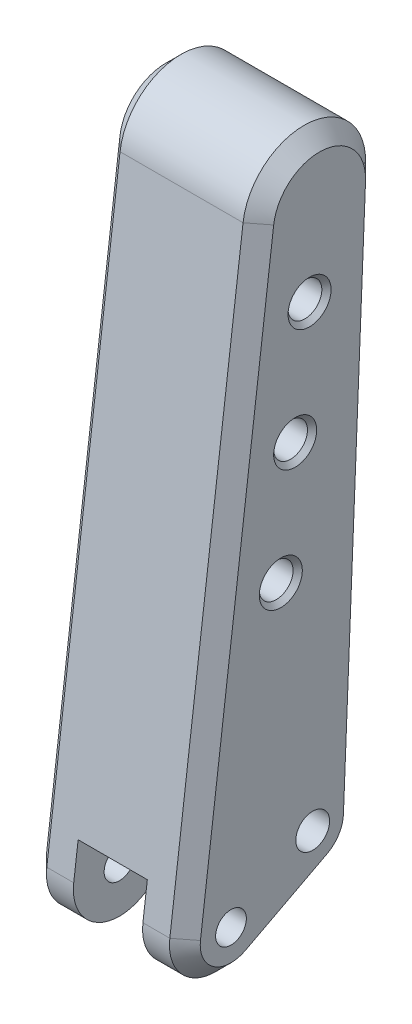
ISO-10303-21;
HEADER;
FILE_DESCRIPTION(('STEP AP214'),'2;1');
FILE_NAME('part.step','',(''),(''),'','','');
FILE_SCHEMA(('AUTOMOTIVE_DESIGN { 1 0 10303 214 1 1 1 1 }'));
ENDSEC;
DATA;
#1=APPLICATION_CONTEXT('core data for automotive mechanical design processes');
#2=APPLICATION_PROTOCOL_DEFINITION('international standard','automotive_design',2000,#1);
#3=PRODUCT_CONTEXT('',#1,'mechanical');
#4=PRODUCT('Part','Part','',(#3));
#5=PRODUCT_RELATED_PRODUCT_CATEGORY('part','',(#4));
#6=PRODUCT_DEFINITION_FORMATION('','',#4);
#7=PRODUCT_DEFINITION_CONTEXT('part definition',#1,'design');
#8=PRODUCT_DEFINITION('design','',#6,#7);
#9=PRODUCT_DEFINITION_SHAPE('','',#8);
#10=(LENGTH_UNIT() NAMED_UNIT(*) SI_UNIT(.MILLI.,.METRE.));
#11=(NAMED_UNIT(*) PLANE_ANGLE_UNIT() SI_UNIT($,.RADIAN.));
#12=(NAMED_UNIT(*) SI_UNIT($,.STERADIAN.) SOLID_ANGLE_UNIT());
#13=UNCERTAINTY_MEASURE_WITH_UNIT(LENGTH_MEASURE(1.E-05),#10,'distance_accuracy_value','');
#14=(GEOMETRIC_REPRESENTATION_CONTEXT(3) GLOBAL_UNCERTAINTY_ASSIGNED_CONTEXT((#13)) GLOBAL_UNIT_ASSIGNED_CONTEXT((#10,
#11,#12)) REPRESENTATION_CONTEXT('',''));
#15=CARTESIAN_POINT('',(0.,0.,0.));
#16=DIRECTION('',(0.,0.,1.));
#17=DIRECTION('',(1.,0.,0.));
#18=AXIS2_PLACEMENT_3D('',#15,#16,#17);
#19=CARTESIAN_POINT('',(-5.,81.8831087943768,0.204953817514453));
#20=DIRECTION('',(-1.,0.,0.));
#21=DIRECTION('',(0.,0.,1.));
#22=AXIS2_PLACEMENT_3D('',#19,#20,#21);
#23=CONICAL_SURFACE('',#22,1.4,0.78539816339745);
#24=CARTESIAN_POINT('',(-5.,81.8831087943768,0.204953817514453));
#25=DIRECTION('',(1.,0.,0.));
#26=DIRECTION('',(0.,0.,-1.));
#27=AXIS2_PLACEMENT_3D('',#24,#25,#26);
#28=CIRCLE('',#27,1.4);
#29=CARTESIAN_POINT('',(-5.,81.8831087943768,-1.19504618248555));
#30=VERTEX_POINT('',#29);
#31=EDGE_CURVE('E155',#30,#30,#28,.T.);
#32=ORIENTED_EDGE('',*,*,#31,.F.);
#33=EDGE_LOOP('',(#32));
#34=FACE_BOUND('',#33,.T.);
#35=CARTESIAN_POINT('',(-4.7,81.8831087943768,0.204953817514453));
#36=DIRECTION('',(-1.,0.,0.));
#37=DIRECTION('',(0.,0.,-1.));
#38=AXIS2_PLACEMENT_3D('',#35,#36,#37);
#39=CIRCLE('',#38,1.1);
#40=CARTESIAN_POINT('',(-4.7,81.8831087943768,-0.895046182485547));
#41=VERTEX_POINT('',#40);
#42=EDGE_CURVE('E11',#41,#41,#39,.T.);
#43=ORIENTED_EDGE('',*,*,#42,.F.);
#44=EDGE_LOOP('',(#43));
#45=FACE_BOUND('',#44,.T.);
#46=ADVANCED_FACE('F17',(#34,#45),#23,.F.);
#47=CARTESIAN_POINT('',(-5.,67.,2.07393017229938));
#48=DIRECTION('',(-1.,0.,0.));
#49=DIRECTION('',(0.,0.,1.));
#50=AXIS2_PLACEMENT_3D('',#47,#48,#49);
#51=CONICAL_SURFACE('',#50,1.4,0.78539816339745);
#52=CARTESIAN_POINT('',(-5.,67.,2.07393017229938));
#53=DIRECTION('',(1.,0.,0.));
#54=DIRECTION('',(0.,0.,-1.));
#55=AXIS2_PLACEMENT_3D('',#52,#53,#54);
#56=CIRCLE('',#55,1.4);
#57=CARTESIAN_POINT('',(-5.,67.,0.673930172299375));
#58=VERTEX_POINT('',#57);
#59=EDGE_CURVE('E160',#58,#58,#56,.T.);
#60=ORIENTED_EDGE('',*,*,#59,.F.);
#61=EDGE_LOOP('',(#60));
#62=FACE_BOUND('',#61,.T.);
#63=CARTESIAN_POINT('',(-4.7,67.,2.07393017229938));
#64=DIRECTION('',(-1.,0.,0.));
#65=DIRECTION('',(0.,0.,-1.));
#66=AXIS2_PLACEMENT_3D('',#63,#64,#65);
#67=CIRCLE('',#66,1.1);
#68=CARTESIAN_POINT('',(-4.7,67.,0.973930172299375));
#69=VERTEX_POINT('',#68);
#70=EDGE_CURVE('E84',#69,#69,#67,.T.);
#71=ORIENTED_EDGE('',*,*,#70,.F.);
#72=EDGE_LOOP('',(#71));
#73=FACE_BOUND('',#72,.T.);
#74=ADVANCED_FACE('F615',(#62,#73),#51,.F.);
#75=CARTESIAN_POINT('',(-5.,74.4415543971884,1.13944199490691));
#76=DIRECTION('',(-1.,0.,0.));
#77=DIRECTION('',(0.,0.,1.));
#78=AXIS2_PLACEMENT_3D('',#75,#76,#77);
#79=CONICAL_SURFACE('',#78,1.4,0.78539816339745);
#80=CARTESIAN_POINT('',(-5.,74.4415543971884,1.13944199490691));
#81=DIRECTION('',(1.,0.,0.));
#82=DIRECTION('',(0.,0.,-1.));
#83=AXIS2_PLACEMENT_3D('',#80,#81,#82);
#84=CIRCLE('',#83,1.4);
#85=CARTESIAN_POINT('',(-5.,74.4415543971884,-0.260558005093086));
#86=VERTEX_POINT('',#85);
#87=EDGE_CURVE('E172',#86,#86,#84,.T.);
#88=ORIENTED_EDGE('',*,*,#87,.F.);
#89=EDGE_LOOP('',(#88));
#90=FACE_BOUND('',#89,.T.);
#91=CARTESIAN_POINT('',(-4.7,74.4415543971884,1.13944199490691));
#92=DIRECTION('',(-1.,0.,0.));
#93=DIRECTION('',(0.,0.,-1.));
#94=AXIS2_PLACEMENT_3D('',#91,#92,#93);
#95=CIRCLE('',#94,1.1);
#96=CARTESIAN_POINT('',(-4.7,74.4415543971884,0.0394419949069141));
#97=VERTEX_POINT('',#96);
#98=EDGE_CURVE('E85',#97,#97,#95,.T.);
#99=ORIENTED_EDGE('',*,*,#98,.F.);
#100=EDGE_LOOP('',(#99));
#101=FACE_BOUND('',#100,.T.);
#102=ADVANCED_FACE('F620',(#90,#101),#79,.F.);
#103=CARTESIAN_POINT('',(5.,81.8831087943768,0.204953817514453));
#104=DIRECTION('',(1.,0.,0.));
#105=DIRECTION('',(0.,0.,-1.));
#106=AXIS2_PLACEMENT_3D('',#103,#104,#105);
#107=CONICAL_SURFACE('',#106,1.4,0.785398163397448);
#108=CARTESIAN_POINT('',(5.,81.8831087943768,0.204953817514453));
#109=DIRECTION('',(-1.,0.,0.));
#110=DIRECTION('',(0.,0.,-1.));
#111=AXIS2_PLACEMENT_3D('',#108,#109,#110);
#112=CIRCLE('',#111,1.4);
#113=CARTESIAN_POINT('',(5.,81.8831087943768,-1.19504618248555));
#114=VERTEX_POINT('',#113);
#115=EDGE_CURVE('E140',#114,#114,#112,.T.);
#116=ORIENTED_EDGE('',*,*,#115,.F.);
#117=EDGE_LOOP('',(#116));
#118=FACE_BOUND('',#117,.T.);
#119=CARTESIAN_POINT('',(4.7,81.8831087943768,0.204953817514453));
#120=DIRECTION('',(1.,0.,0.));
#121=DIRECTION('',(0.,0.,-1.));
#122=AXIS2_PLACEMENT_3D('',#119,#120,#121);
#123=CIRCLE('',#122,1.1);
#124=CARTESIAN_POINT('',(4.7,81.8831087943768,-0.895046182485547));
#125=VERTEX_POINT('',#124);
#126=EDGE_CURVE('E25',#125,#125,#123,.T.);
#127=ORIENTED_EDGE('',*,*,#126,.F.);
#128=EDGE_LOOP('',(#127));
#129=FACE_BOUND('',#128,.T.);
#130=ADVANCED_FACE('F625',(#118,#129),#107,.F.);
#131=CARTESIAN_POINT('',(5.,67.,2.07393017229938));
#132=DIRECTION('',(1.,0.,0.));
#133=DIRECTION('',(0.,0.,-1.));
#134=AXIS2_PLACEMENT_3D('',#131,#132,#133);
#135=CONICAL_SURFACE('',#134,1.4,0.785398163397448);
#136=CARTESIAN_POINT('',(5.,67.,2.07393017229938));
#137=DIRECTION('',(-1.,0.,0.));
#138=DIRECTION('',(0.,0.,-1.));
#139=AXIS2_PLACEMENT_3D('',#136,#137,#138);
#140=CIRCLE('',#139,1.4);
#141=CARTESIAN_POINT('',(5.,67.,0.673930172299375));
#142=VERTEX_POINT('',#141);
#143=EDGE_CURVE('E136',#142,#142,#140,.T.);
#144=ORIENTED_EDGE('',*,*,#143,.F.);
#145=EDGE_LOOP('',(#144));
#146=FACE_BOUND('',#145,.T.);
#147=CARTESIAN_POINT('',(4.7,67.,2.07393017229938));
#148=DIRECTION('',(1.,0.,0.));
#149=DIRECTION('',(0.,0.,-1.));
#150=AXIS2_PLACEMENT_3D('',#147,#148,#149);
#151=CIRCLE('',#150,1.1);
#152=CARTESIAN_POINT('',(4.7,67.,0.973930172299375));
#153=VERTEX_POINT('',#152);
#154=EDGE_CURVE('E80',#153,#153,#151,.T.);
#155=ORIENTED_EDGE('',*,*,#154,.F.);
#156=EDGE_LOOP('',(#155));
#157=FACE_BOUND('',#156,.T.);
#158=ADVANCED_FACE('F633',(#146,#157),#135,.F.);
#159=CARTESIAN_POINT('',(5.,74.4415543971884,1.13944199490691));
#160=DIRECTION('',(1.,0.,0.));
#161=DIRECTION('',(0.,0.,-1.));
#162=AXIS2_PLACEMENT_3D('',#159,#160,#161);
#163=CONICAL_SURFACE('',#162,1.4,0.785398163397448);
#164=CARTESIAN_POINT('',(5.,74.4415543971884,1.13944199490691));
#165=DIRECTION('',(-1.,0.,0.));
#166=DIRECTION('',(0.,0.,-1.));
#167=AXIS2_PLACEMENT_3D('',#164,#165,#166);
#168=CIRCLE('',#167,1.4);
#169=CARTESIAN_POINT('',(5.,74.4415543971884,-0.260558005093086));
#170=VERTEX_POINT('',#169);
#171=EDGE_CURVE('E132',#170,#170,#168,.T.);
#172=ORIENTED_EDGE('',*,*,#171,.F.);
#173=EDGE_LOOP('',(#172));
#174=FACE_BOUND('',#173,.T.);
#175=CARTESIAN_POINT('',(4.7,74.4415543971884,1.13944199490691));
#176=DIRECTION('',(1.,0.,0.));
#177=DIRECTION('',(0.,0.,-1.));
#178=AXIS2_PLACEMENT_3D('',#175,#176,#177);
#179=CIRCLE('',#178,1.1);
#180=CARTESIAN_POINT('',(4.7,74.4415543971884,0.0394419949069141));
#181=VERTEX_POINT('',#180);
#182=EDGE_CURVE('E93',#181,#181,#179,.T.);
#183=ORIENTED_EDGE('',*,*,#182,.F.);
#184=EDGE_LOOP('',(#183));
#185=FACE_BOUND('',#184,.T.);
#186=ADVANCED_FACE('F635',(#174,#185),#163,.F.);
#187=CARTESIAN_POINT('',(-5.,81.8831087943768,0.204953817514453));
#188=DIRECTION('',(1.,0.,0.));
#189=DIRECTION('',(0.,0.,-1.));
#190=AXIS2_PLACEMENT_3D('',#187,#188,#189);
#191=CYLINDRICAL_SURFACE('',#190,1.1);
#192=ORIENTED_EDGE('',*,*,#42,.T.);
#193=EDGE_LOOP('',(#192));
#194=FACE_BOUND('',#193,.T.);
#195=ORIENTED_EDGE('',*,*,#126,.T.);
#196=EDGE_LOOP('',(#195));
#197=FACE_BOUND('',#196,.T.);
#198=ADVANCED_FACE('F638',(#194,#197),#191,.F.);
#199=CARTESIAN_POINT('',(-5.,67.,2.07393017229938));
#200=DIRECTION('',(1.,0.,0.));
#201=DIRECTION('',(0.,0.,-1.));
#202=AXIS2_PLACEMENT_3D('',#199,#200,#201);
#203=CYLINDRICAL_SURFACE('',#202,1.1);
#204=ORIENTED_EDGE('',*,*,#70,.T.);
#205=EDGE_LOOP('',(#204));
#206=FACE_BOUND('',#205,.T.);
#207=ORIENTED_EDGE('',*,*,#154,.T.);
#208=EDGE_LOOP('',(#207));
#209=FACE_BOUND('',#208,.T.);
#210=ADVANCED_FACE('F81',(#206,#209),#203,.F.);
#211=CARTESIAN_POINT('',(-5.,74.4415543971884,1.13944199490691));
#212=DIRECTION('',(1.,0.,0.));
#213=DIRECTION('',(0.,0.,-1.));
#214=AXIS2_PLACEMENT_3D('',#211,#212,#213);
#215=CYLINDRICAL_SURFACE('',#214,1.1);
#216=ORIENTED_EDGE('',*,*,#98,.T.);
#217=EDGE_LOOP('',(#216));
#218=FACE_BOUND('',#217,.T.);
#219=ORIENTED_EDGE('',*,*,#182,.T.);
#220=EDGE_LOOP('',(#219));
#221=FACE_BOUND('',#220,.T.);
#222=ADVANCED_FACE('F642',(#218,#221),#215,.F.);
#223=CARTESIAN_POINT('',(-4.,87.0115299305638,-0.439057993010984));
#224=DIRECTION('',(1.,0.,0.));
#225=DIRECTION('',(0.,0.,-1.));
#226=AXIS2_PLACEMENT_3D('',#223,#224,#225);
#227=CONICAL_SURFACE('',#226,4.,0.785398163397448);
#228=DIRECTION('',(-0.707106781186548,0.0290562978632458,0.70650954102155));
#229=VECTOR('',#228,1.);
#230=CARTESIAN_POINT('',(-4.,86.8471626885215,-4.43567949244561));
#231=LINE('',#230,#229);
#232=CARTESIAN_POINT('',(-4.,86.8471626885215,-4.43567949244561));
#233=VERTEX_POINT('',#232);
#234=CARTESIAN_POINT('',(-5.,86.8882544990321,-3.43652411758694));
#235=VERTEX_POINT('',#234);
#236=EDGE_CURVE('E239',#233,#235,#231,.T.);
#237=ORIENTED_EDGE('',*,*,#236,.T.);
#238=CARTESIAN_POINT('',(-5.,87.0115299305638,-0.439057993010984));
#239=DIRECTION('',(-1.,0.,0.));
#240=DIRECTION('',(0.,0.,-1.));
#241=AXIS2_PLACEMENT_3D('',#238,#239,#240);
#242=CIRCLE('',#241,3.);
#243=CARTESIAN_POINT('',(-5.,87.3853252015208,2.53756376586443));
#244=VERTEX_POINT('',#243);
#245=EDGE_CURVE('E179',#244,#235,#242,.T.);
#246=ORIENTED_EDGE('',*,*,#245,.F.);
#247=DIRECTION('',(0.707106781186547,0.0881043902897135,0.701596476909398));
#248=VECTOR('',#247,1.);
#249=CARTESIAN_POINT('',(-5.,87.3853252015208,2.53756376586443));
#250=LINE('',#249,#248);
#251=CARTESIAN_POINT('',(-4.,87.5099236251731,3.52977101882286));
#252=VERTEX_POINT('',#251);
#253=EDGE_CURVE('E149',#244,#252,#250,.T.);
#254=ORIENTED_EDGE('',*,*,#253,.T.);
#255=CARTESIAN_POINT('',(-4.,87.0115299305638,-0.439057993010984));
#256=DIRECTION('',(1.,0.,0.));
#257=DIRECTION('',(0.,0.,-1.));
#258=AXIS2_PLACEMENT_3D('',#255,#256,#257);
#259=CIRCLE('',#258,4.);
#260=EDGE_CURVE('E308',#233,#252,#259,.T.);
#261=ORIENTED_EDGE('',*,*,#260,.F.);
#262=EDGE_LOOP('',(#237,#246,#254,#261));
#263=FACE_BOUND('',#262,.T.);
#264=ADVANCED_FACE('F646',(#263),#227,.T.);
#265=CARTESIAN_POINT('',(-5.,68.9793389637328,4.84893254910679));
#266=DIRECTION('',(-0.707106781186548,0.0881043902897154,0.701596476909396));
#267=DIRECTION('',(0.123642360594641,0.992326844676987,0.));
#268=AXIS2_PLACEMENT_3D('',#265,#266,#267);
#269=PLANE('',#268);
#270=DIRECTION('',(0.707106781186548,0.0881043902897135,0.701596476909397));
#271=VECTOR('',#270,1.);
#272=CARTESIAN_POINT('',(-5.,49.4652500334665,7.29945355918083));
#273=LINE('',#272,#271);
#274=CARTESIAN_POINT('',(-5.,49.4652500334665,7.29945355918083));
#275=VERTEX_POINT('',#274);
#276=CARTESIAN_POINT('',(-4.,49.5898484571188,8.29166081213928));
#277=VERTEX_POINT('',#276);
#278=EDGE_CURVE('E238',#275,#277,#273,.T.);
#279=ORIENTED_EDGE('',*,*,#278,.T.);
#280=DIRECTION('',(0.,-0.992207252958451,0.124598423652328));
#281=VECTOR('',#280,1.);
#282=CARTESIAN_POINT('',(-4.,49.5898484571188,8.29166081213928));
#283=LINE('',#282,#281);
#284=EDGE_CURVE('E329',#252,#277,#283,.T.);
#285=ORIENTED_EDGE('',*,*,#284,.F.);
#286=ORIENTED_EDGE('',*,*,#253,.F.);
#287=DIRECTION('',(0.,0.992207252958451,-0.124598423652328));
#288=VECTOR('',#287,1.);
#289=CARTESIAN_POINT('',(-5.,87.3853252015208,2.53756376586443));
#290=LINE('',#289,#288);
#291=EDGE_CURVE('E159',#275,#244,#290,.T.);
#292=ORIENTED_EDGE('',*,*,#291,.F.);
#293=EDGE_LOOP('',(#279,#285,#286,#292));
#294=FACE_BOUND('',#293,.T.);
#295=ADVANCED_FACE('F650',(#294),#269,.T.);
#296=CARTESIAN_POINT('',(-4.,69.3619436284946,-3.71657280851079));
#297=DIRECTION('',(0.707106781186548,0.0290562978632501,0.706509541021551));
#298=DIRECTION('',(0.,-0.999155374858667,0.0410918105105606));
#299=AXIS2_PLACEMENT_3D('',#296,#297,#298);
#300=PLANE('',#299);
#301=DIRECTION('',(-0.707106781186547,0.0290562978632997,0.70650954102155));
#302=VECTOR('',#301,1.);
#303=CARTESIAN_POINT('',(-4.,51.8767245684681,-2.99746612457598));
#304=LINE('',#303,#302);
#305=CARTESIAN_POINT('',(-4.,51.8767245684681,-2.99746612457598));
#306=VERTEX_POINT('',#305);
#307=CARTESIAN_POINT('',(-5.,51.9178163789787,-1.99831074971733));
#308=VERTEX_POINT('',#307);
#309=EDGE_CURVE('E234',#306,#308,#304,.T.);
#310=ORIENTED_EDGE('',*,*,#309,.T.);
#311=DIRECTION('',(0.,-0.999155374858667,0.0410918105105606));
#312=VECTOR('',#311,1.);
#313=CARTESIAN_POINT('',(-5.,68.4239866599391,-2.67715253799897));
#314=LINE('',#313,#312);
#315=EDGE_CURVE('E185',#235,#308,#314,.T.);
#316=ORIENTED_EDGE('',*,*,#315,.F.);
#317=ORIENTED_EDGE('',*,*,#236,.F.);
#318=DIRECTION('',(0.,0.999155374858667,-0.0410918105105606));
#319=VECTOR('',#318,1.);
#320=CARTESIAN_POINT('',(-4.,69.3619436284946,-3.71657280851079));
#321=LINE('',#320,#319);
#322=EDGE_CURVE('E120',#306,#233,#321,.T.);
#323=ORIENTED_EDGE('',*,*,#322,.F.);
#324=EDGE_LOOP('',(#310,#316,#317,#323));
#325=FACE_BOUND('',#324,.T.);
#326=ADVANCED_FACE('F653',(#325),#300,.F.);
#327=CARTESIAN_POINT('',(-5.,49.2160531861619,5.31503905326393));
#328=DIRECTION('',(1.,0.,0.));
#329=DIRECTION('',(0.,0.,-1.));
#330=AXIS2_PLACEMENT_3D('',#327,#328,#329);
#331=CONICAL_SURFACE('',#330,2.,0.785398163397449);
#332=DIRECTION('',(0.707106781186548,-0.626383359472371,-0.328091278421273));
#333=VECTOR('',#332,1.);
#334=CARTESIAN_POINT('',(-5.,47.4443735017405,4.38705678198455));
#335=LINE('',#334,#333);
#336=CARTESIAN_POINT('',(-5.,47.4443735017405,4.38705678198455));
#337=VERTEX_POINT('',#336);
#338=CARTESIAN_POINT('',(-4.,46.5585336595299,3.92306564634486));
#339=VERTEX_POINT('',#338);
#340=EDGE_CURVE('E230',#337,#339,#335,.T.);
#341=ORIENTED_EDGE('',*,*,#340,.T.);
#342=CARTESIAN_POINT('',(-4.,49.2160531861619,5.31503905326393));
#343=DIRECTION('',(1.,0.,0.));
#344=DIRECTION('',(0.,0.,-1.));
#345=AXIS2_PLACEMENT_3D('',#342,#343,#344);
#346=CIRCLE('',#345,3.);
#347=EDGE_CURVE('E415',#277,#339,#346,.T.);
#348=ORIENTED_EDGE('',*,*,#347,.F.);
#349=ORIENTED_EDGE('',*,*,#278,.F.);
#350=CARTESIAN_POINT('',(-5.,49.2160531861619,5.31503905326393));
#351=DIRECTION('',(-1.,0.,0.));
#352=DIRECTION('',(0.,0.,-1.));
#353=AXIS2_PLACEMENT_3D('',#350,#351,#352);
#354=CIRCLE('',#353,2.);
#355=EDGE_CURVE('E189',#337,#275,#354,.T.);
#356=ORIENTED_EDGE('',*,*,#355,.F.);
#357=EDGE_LOOP('',(#341,#348,#349,#356));
#358=FACE_BOUND('',#357,.T.);
#359=ADVANCED_FACE('F475',(#358),#331,.T.);
#360=CARTESIAN_POINT('',(-5.,52.,1.58510357617381E-13));
#361=DIRECTION('',(1.,0.,0.));
#362=DIRECTION('',(0.,0.,-1.));
#363=AXIS2_PLACEMENT_3D('',#360,#361,#362);
#364=CONICAL_SURFACE('',#363,2.00000000000015,0.78539816339745);
#365=DIRECTION('',(-0.707106781186548,0.626383359472371,0.328091278421274));
#366=VECTOR('',#365,1.);
#367=CARTESIAN_POINT('',(-4.,49.342480473368,-1.39197340691906));
#368=LINE('',#367,#366);
#369=CARTESIAN_POINT('',(-4.,49.342480473368,-1.39197340691906));
#370=VERTEX_POINT('',#369);
#371=CARTESIAN_POINT('',(-5.,50.2283203155786,-0.927982271279406));
#372=VERTEX_POINT('',#371);
#373=EDGE_CURVE('E231',#370,#372,#368,.T.);
#374=ORIENTED_EDGE('',*,*,#373,.T.);
#375=CARTESIAN_POINT('',(-5.,52.,1.58510357617381E-13));
#376=DIRECTION('',(-1.,0.,0.));
#377=DIRECTION('',(0.,0.,-1.));
#378=AXIS2_PLACEMENT_3D('',#375,#376,#377);
#379=CIRCLE('',#378,2.00000000000015);
#380=EDGE_CURVE('E180',#308,#372,#379,.T.);
#381=ORIENTED_EDGE('',*,*,#380,.F.);
#382=ORIENTED_EDGE('',*,*,#309,.F.);
#383=CARTESIAN_POINT('',(-4.,52.,1.58510357617381E-13));
#384=DIRECTION('',(1.,0.,0.));
#385=DIRECTION('',(0.,0.,-1.));
#386=AXIS2_PLACEMENT_3D('',#383,#384,#385);
#387=CIRCLE('',#386,3.00000000000015);
#388=EDGE_CURVE('E106',#370,#306,#387,.T.);
#389=ORIENTED_EDGE('',*,*,#388,.F.);
#390=EDGE_LOOP('',(#374,#381,#382,#389));
#391=FACE_BOUND('',#390,.T.);
#392=ADVANCED_FACE('F656',(#391),#364,.T.);
#393=CARTESIAN_POINT('',(-4.,47.950507066449,1.26554611971289));
#394=DIRECTION('',(0.707106781186547,0.626383359472372,0.328091278421274));
#395=DIRECTION('',(0.,0.463991135639693,-0.88583984221065));
#396=AXIS2_PLACEMENT_3D('',#393,#394,#395);
#397=PLANE('',#396);
#398=ORIENTED_EDGE('',*,*,#340,.F.);
#399=DIRECTION('',(0.,-0.463991135639692,0.88583984221065));
#400=VECTOR('',#399,1.);
#401=CARTESIAN_POINT('',(-5.,53.0085100943767,-6.23584849068616));
#402=LINE('',#401,#400);
#403=EDGE_CURVE('E184',#372,#337,#402,.T.);
#404=ORIENTED_EDGE('',*,*,#403,.F.);
#405=ORIENTED_EDGE('',*,*,#373,.F.);
#406=DIRECTION('',(0.,0.463991135639692,-0.88583984221065));
#407=VECTOR('',#406,1.);
#408=CARTESIAN_POINT('',(-4.,47.950507066449,1.26554611971289));
#409=LINE('',#408,#407);
#410=EDGE_CURVE('E421',#339,#370,#409,.T.);
#411=ORIENTED_EDGE('',*,*,#410,.F.);
#412=EDGE_LOOP('',(#398,#404,#405,#411));
#413=FACE_BOUND('',#412,.T.);
#414=ADVANCED_FACE('F484',(#413),#397,.F.);
#415=CARTESIAN_POINT('',(5.,87.0115299305638,-0.439057993010984));
#416=DIRECTION('',(-1.,0.,0.));
#417=DIRECTION('',(0.,0.,1.));
#418=AXIS2_PLACEMENT_3D('',#415,#416,#417);
#419=CONICAL_SURFACE('',#418,3.,0.785398163397448);
#420=DIRECTION('',(-0.707106781186548,-0.0290562978632556,-0.70650954102155));
#421=VECTOR('',#420,1.);
#422=CARTESIAN_POINT('',(5.,86.8882544990321,-3.43652411758694));
#423=LINE('',#422,#421);
#424=CARTESIAN_POINT('',(5.,86.8882544990321,-3.43652411758694));
#425=VERTEX_POINT('',#424);
#426=CARTESIAN_POINT('',(4.,86.8471626885215,-4.43567949244561));
#427=VERTEX_POINT('',#426);
#428=EDGE_CURVE('E222',#425,#427,#423,.T.);
#429=ORIENTED_EDGE('',*,*,#428,.T.);
#430=CARTESIAN_POINT('',(4.,87.0115299305638,-0.439057993010984));
#431=DIRECTION('',(-1.,0.,0.));
#432=DIRECTION('',(0.,0.,-1.));
#433=AXIS2_PLACEMENT_3D('',#430,#431,#432);
#434=CIRCLE('',#433,4.);
#435=CARTESIAN_POINT('',(4.,87.5099236251731,3.52977101882286));
#436=VERTEX_POINT('',#435);
#437=EDGE_CURVE('E312',#436,#427,#434,.T.);
#438=ORIENTED_EDGE('',*,*,#437,.F.);
#439=DIRECTION('',(0.707106781186548,-0.0881043902897134,-0.701596476909397));
#440=VECTOR('',#439,1.);
#441=CARTESIAN_POINT('',(4.,87.5099236251731,3.52977101882288));
#442=LINE('',#441,#440);
#443=CARTESIAN_POINT('',(5.,87.3853252015208,2.53756376586443));
#444=VERTEX_POINT('',#443);
#445=EDGE_CURVE('E226',#436,#444,#442,.T.);
#446=ORIENTED_EDGE('',*,*,#445,.T.);
#447=CARTESIAN_POINT('',(5.,87.0115299305638,-0.439057993010984));
#448=DIRECTION('',(1.,0.,0.));
#449=DIRECTION('',(0.,0.,-1.));
#450=AXIS2_PLACEMENT_3D('',#447,#448,#449);
#451=CIRCLE('',#450,3.);
#452=EDGE_CURVE('E145',#425,#444,#451,.T.);
#453=ORIENTED_EDGE('',*,*,#452,.F.);
#454=EDGE_LOOP('',(#429,#438,#446,#453));
#455=FACE_BOUND('',#454,.T.);
#456=ADVANCED_FACE('F662',(#455),#419,.T.);
#457=CARTESIAN_POINT('',(4.,50.7303826707671,8.1484359317341));
#458=DIRECTION('',(-0.707106781186548,-0.0881043902897155,-0.701596476909397));
#459=DIRECTION('',(-0.704335463552126,0.,0.709867279695868));
#460=AXIS2_PLACEMENT_3D('',#457,#458,#459);
#461=PLANE('',#460);
#462=DIRECTION('',(0.707106781186548,-0.0881043902897135,-0.701596476909397));
#463=VECTOR('',#462,1.);
#464=CARTESIAN_POINT('',(4.,49.5898484571188,8.29166081213928));
#465=LINE('',#464,#463);
#466=CARTESIAN_POINT('',(4.,49.5898484571188,8.29166081213928));
#467=VERTEX_POINT('',#466);
#468=CARTESIAN_POINT('',(5.,49.4652500334665,7.29945355918083));
#469=VERTEX_POINT('',#468);
#470=EDGE_CURVE('E218',#467,#469,#465,.T.);
#471=ORIENTED_EDGE('',*,*,#470,.T.);
#472=DIRECTION('',(0.,-0.992207252958451,0.124598423652328));
#473=VECTOR('',#472,1.);
#474=CARTESIAN_POINT('',(5.,68.9793389637328,4.84893254910679));
#475=LINE('',#474,#473);
#476=EDGE_CURVE('E150',#444,#469,#475,.T.);
#477=ORIENTED_EDGE('',*,*,#476,.F.);
#478=ORIENTED_EDGE('',*,*,#445,.F.);
#479=DIRECTION('',(0.,0.992207252958451,-0.124598423652328));
#480=VECTOR('',#479,1.);
#481=CARTESIAN_POINT('',(4.,50.7303826707671,8.1484359317341));
#482=LINE('',#481,#480);
#483=EDGE_CURVE('E307',#467,#436,#482,.T.);
#484=ORIENTED_EDGE('',*,*,#483,.F.);
#485=EDGE_LOOP('',(#471,#477,#478,#484));
#486=FACE_BOUND('',#485,.T.);
#487=ADVANCED_FACE('F665',(#486),#461,.F.);
#488=CARTESIAN_POINT('',(5.,68.4239866599391,-2.67715253799897));
#489=DIRECTION('',(0.707106781186548,-0.0290562978632501,-0.706509541021551));
#490=DIRECTION('',(0.,-0.999155374858667,0.0410918105105606));
#491=AXIS2_PLACEMENT_3D('',#488,#489,#490);
#492=PLANE('',#491);
#493=DIRECTION('',(-0.707106781186548,-0.0290562978632997,-0.706509541021549));
#494=VECTOR('',#493,1.);
#495=CARTESIAN_POINT('',(5.,51.9178163789787,-1.99831074971732));
#496=LINE('',#495,#494);
#497=CARTESIAN_POINT('',(5.,51.9178163789787,-1.99831074971732));
#498=VERTEX_POINT('',#497);
#499=CARTESIAN_POINT('',(4.,51.8767245684681,-2.99746612457598));
#500=VERTEX_POINT('',#499);
#501=EDGE_CURVE('E214',#498,#500,#496,.T.);
#502=ORIENTED_EDGE('',*,*,#501,.T.);
#503=DIRECTION('',(0.,-0.999155374858667,0.0410918105105606));
#504=VECTOR('',#503,1.);
#505=CARTESIAN_POINT('',(4.,51.8767245684681,-2.99746612457598));
#506=LINE('',#505,#504);
#507=EDGE_CURVE('E113',#427,#500,#506,.T.);
#508=ORIENTED_EDGE('',*,*,#507,.F.);
#509=ORIENTED_EDGE('',*,*,#428,.F.);
#510=DIRECTION('',(0.,0.999155374858667,-0.0410918105105606));
#511=VECTOR('',#510,1.);
#512=CARTESIAN_POINT('',(5.,86.8882544990321,-3.43652411758694));
#513=LINE('',#512,#511);
#514=EDGE_CURVE('E141',#498,#425,#513,.T.);
#515=ORIENTED_EDGE('',*,*,#514,.F.);
#516=EDGE_LOOP('',(#502,#508,#509,#515));
#517=FACE_BOUND('',#516,.T.);
#518=ADVANCED_FACE('F669',(#517),#492,.T.);
#519=CARTESIAN_POINT('',(4.,49.2160531861619,5.31503905326393));
#520=DIRECTION('',(-1.,0.,0.));
#521=DIRECTION('',(0.,0.,1.));
#522=AXIS2_PLACEMENT_3D('',#519,#520,#521);
#523=CONICAL_SURFACE('',#522,3.,0.785398163397449);
#524=DIRECTION('',(0.707106781186548,0.626383359472371,0.328091278421273));
#525=VECTOR('',#524,1.);
#526=CARTESIAN_POINT('',(4.,46.5585336595299,3.92306564634485));
#527=LINE('',#526,#525);
#528=CARTESIAN_POINT('',(4.,46.5585336595299,3.92306564634486));
#529=VERTEX_POINT('',#528);
#530=CARTESIAN_POINT('',(5.,47.4443735017405,4.38705678198454));
#531=VERTEX_POINT('',#530);
#532=EDGE_CURVE('E114',#529,#531,#527,.T.);
#533=ORIENTED_EDGE('',*,*,#532,.T.);
#534=CARTESIAN_POINT('',(5.,49.2160531861619,5.31503905326393));
#535=DIRECTION('',(1.,0.,0.));
#536=DIRECTION('',(0.,0.,-1.));
#537=AXIS2_PLACEMENT_3D('',#534,#535,#536);
#538=CIRCLE('',#537,2.);
#539=EDGE_CURVE('E154',#469,#531,#538,.T.);
#540=ORIENTED_EDGE('',*,*,#539,.F.);
#541=ORIENTED_EDGE('',*,*,#470,.F.);
#542=CARTESIAN_POINT('',(4.,49.2160531861619,5.31503905326393));
#543=DIRECTION('',(-1.,0.,0.));
#544=DIRECTION('',(0.,0.,-1.));
#545=AXIS2_PLACEMENT_3D('',#542,#543,#544);
#546=CIRCLE('',#545,3.);
#547=EDGE_CURVE('E266',#529,#467,#546,.T.);
#548=ORIENTED_EDGE('',*,*,#547,.F.);
#549=EDGE_LOOP('',(#533,#540,#541,#548));
#550=FACE_BOUND('',#549,.T.);
#551=ADVANCED_FACE('F674',(#550),#523,.T.);
#552=CARTESIAN_POINT('',(4.,52.,1.58510357617381E-13));
#553=DIRECTION('',(-1.,0.,0.));
#554=DIRECTION('',(0.,0.,1.));
#555=AXIS2_PLACEMENT_3D('',#552,#553,#554);
#556=CONICAL_SURFACE('',#555,3.00000000000015,0.785398163397449);
#557=DIRECTION('',(-0.707106781186548,-0.626383359472371,-0.328091278421273));
#558=VECTOR('',#557,1.);
#559=CARTESIAN_POINT('',(5.,50.2283203155787,-0.927982271279373));
#560=LINE('',#559,#558);
#561=CARTESIAN_POINT('',(5.,50.2283203155786,-0.927982271279407));
#562=VERTEX_POINT('',#561);
#563=CARTESIAN_POINT('',(4.,49.342480473368,-1.39197340691906));
#564=VERTEX_POINT('',#563);
#565=EDGE_CURVE('E118',#562,#564,#560,.T.);
#566=ORIENTED_EDGE('',*,*,#565,.T.);
#567=CARTESIAN_POINT('',(4.,52.,1.58510357617381E-13));
#568=DIRECTION('',(-1.,0.,0.));
#569=DIRECTION('',(0.,0.,-1.));
#570=AXIS2_PLACEMENT_3D('',#567,#568,#569);
#571=CIRCLE('',#570,3.00000000000015);
#572=EDGE_CURVE('E96',#500,#564,#571,.T.);
#573=ORIENTED_EDGE('',*,*,#572,.F.);
#574=ORIENTED_EDGE('',*,*,#501,.F.);
#575=CARTESIAN_POINT('',(5.,52.,1.58510357617381E-13));
#576=DIRECTION('',(1.,0.,0.));
#577=DIRECTION('',(0.,0.,-1.));
#578=AXIS2_PLACEMENT_3D('',#575,#576,#577);
#579=CIRCLE('',#578,2.00000000000015);
#580=EDGE_CURVE('E168',#562,#498,#579,.T.);
#581=ORIENTED_EDGE('',*,*,#580,.F.);
#582=EDGE_LOOP('',(#566,#573,#574,#581));
#583=FACE_BOUND('',#582,.T.);
#584=ADVANCED_FACE('F677',(#583),#556,.T.);
#585=CARTESIAN_POINT('',(5.,53.0085100943767,-6.23584849068616));
#586=DIRECTION('',(0.707106781186547,-0.626383359472372,-0.328091278421274));
#587=DIRECTION('',(0.,0.463991135639693,-0.88583984221065));
#588=AXIS2_PLACEMENT_3D('',#585,#586,#587);
#589=PLANE('',#588);
#590=ORIENTED_EDGE('',*,*,#532,.F.);
#591=DIRECTION('',(0.,-0.463991135639692,0.88583984221065));
#592=VECTOR('',#591,1.);
#593=CARTESIAN_POINT('',(4.,46.5585336595299,3.92306564634486));
#594=LINE('',#593,#592);
#595=EDGE_CURVE('E274',#564,#529,#594,.T.);
#596=ORIENTED_EDGE('',*,*,#595,.F.);
#597=ORIENTED_EDGE('',*,*,#565,.F.);
#598=DIRECTION('',(0.,0.463991135639692,-0.88583984221065));
#599=VECTOR('',#598,1.);
#600=CARTESIAN_POINT('',(5.,50.2283203155787,-0.927982271279372));
#601=LINE('',#600,#599);
#602=EDGE_CURVE('E164',#531,#562,#601,.T.);
#603=ORIENTED_EDGE('',*,*,#602,.F.);
#604=EDGE_LOOP('',(#590,#596,#597,#603));
#605=FACE_BOUND('',#604,.T.);
#606=ADVANCED_FACE('F681',(#605),#589,.T.);
#607=CARTESIAN_POINT('',(2.25,68.6137915583628,1.93799053012649));
#608=DIRECTION('',(1.,0.,0.));
#609=DIRECTION('',(0.,1.,0.));
#610=AXIS2_PLACEMENT_3D('',#607,#608,#609);
#611=PLANE('',#610);
#612=CARTESIAN_POINT('',(2.25,49.2160531861619,5.31503905326393));
#613=DIRECTION('',(1.,0.,0.));
#614=DIRECTION('',(0.,0.,-1.));
#615=AXIS2_PLACEMENT_3D('',#612,#613,#614);
#616=CIRCLE('',#615,1.);
#617=CARTESIAN_POINT('',(2.25,49.2160531861619,4.31503905326393));
#618=VERTEX_POINT('',#617);
#619=EDGE_CURVE('E124',#618,#618,#616,.T.);
#620=ORIENTED_EDGE('',*,*,#619,.T.);
#621=EDGE_LOOP('',(#620));
#622=FACE_BOUND('',#621,.T.);
#623=DIRECTION('',(0.,-0.18266058616197,-0.983176032184962));
#624=VECTOR('',#623,1.);
#625=CARTESIAN_POINT('',(2.25,52.5346862604265,2.87796468321778));
#626=LINE('',#625,#624);
#627=CARTESIAN_POINT('',(2.25,53.0640543216293,5.72730400110054));
#628=VERTEX_POINT('',#627);
#629=CARTESIAN_POINT('',(2.25,52.2009266447781,1.08149363540358));
#630=VERTEX_POINT('',#629);
#631=EDGE_CURVE('E193',#628,#630,#626,.T.);
#632=ORIENTED_EDGE('',*,*,#631,.T.);
#633=CARTESIAN_POINT('',(2.25,52.,1.20129600711394E-13));
#634=DIRECTION('',(1.,0.,0.));
#635=DIRECTION('',(0.,0.,-1.));
#636=AXIS2_PLACEMENT_3D('',#633,#634,#635);
#637=CIRCLE('',#636,1.1);
#638=CARTESIAN_POINT('',(2.25,51.7990733552218,-1.08149363540334));
#639=VERTEX_POINT('',#638);
#640=EDGE_CURVE('E290',#630,#639,#637,.T.);
#641=ORIENTED_EDGE('',*,*,#640,.T.);
#642=DIRECTION('',(0.,-0.182660586161968,-0.983176032184962));
#643=VECTOR('',#642,1.);
#644=CARTESIAN_POINT('',(2.25,51.634678827676,-1.96635206436986));
#645=LINE('',#644,#643);
#646=CARTESIAN_POINT('',(2.25,51.452018241514,-2.94952809655487));
#647=VERTEX_POINT('',#646);
#648=EDGE_CURVE('E380',#639,#647,#645,.T.);
#649=ORIENTED_EDGE('',*,*,#648,.T.);
#650=CARTESIAN_POINT('',(2.25,52.,0.));
#651=DIRECTION('',(-1.,0.,0.));
#652=DIRECTION('',(0.,0.,-1.));
#653=AXIS2_PLACEMENT_3D('',#650,#651,#652);
#654=CIRCLE('',#653,3.);
#655=CARTESIAN_POINT('',(2.25,49.342480473368,-1.39197340691906));
#656=VERTEX_POINT('',#655);
#657=EDGE_CURVE('E98',#647,#656,#654,.T.);
#658=ORIENTED_EDGE('',*,*,#657,.T.);
#659=DIRECTION('',(0.,0.463991135639692,-0.88583984221065));
#660=VECTOR('',#659,1.);
#661=CARTESIAN_POINT('',(2.25,47.950507066449,1.26554611971289));
#662=LINE('',#661,#660);
#663=CARTESIAN_POINT('',(2.25,46.5585336595299,3.92306564634486));
#664=VERTEX_POINT('',#663);
#665=EDGE_CURVE('E277',#664,#656,#662,.T.);
#666=ORIENTED_EDGE('',*,*,#665,.F.);
#667=CARTESIAN_POINT('',(2.25,49.2160531861619,5.31503905326393));
#668=DIRECTION('',(-1.,0.,0.));
#669=DIRECTION('',(0.,0.,-1.));
#670=AXIS2_PLACEMENT_3D('',#667,#668,#669);
#671=CIRCLE('',#670,3.);
#672=CARTESIAN_POINT('',(2.25,49.5898484571188,8.29166081213928));
#673=VERTEX_POINT('',#672);
#674=EDGE_CURVE('E269',#664,#673,#671,.T.);
#675=ORIENTED_EDGE('',*,*,#674,.T.);
#676=DIRECTION('',(0.,0.992207252958451,-0.124598423652328));
#677=VECTOR('',#676,1.);
#678=CARTESIAN_POINT('',(2.25,50.7303826707671,8.1484359317341));
#679=LINE('',#678,#677);
#680=CARTESIAN_POINT('',(2.25,51.8709168844154,8.00521105132892));
#681=VERTEX_POINT('',#680);
#682=EDGE_CURVE('E341',#673,#681,#679,.T.);
#683=ORIENTED_EDGE('',*,*,#682,.T.);
#684=DIRECTION('',(0.,0.463991135639691,-0.885839842210651));
#685=VECTOR('',#684,1.);
#686=CARTESIAN_POINT('',(2.25,52.4674856030224,6.86625752621473));
#687=LINE('',#686,#685);
#688=EDGE_CURVE('E205',#681,#628,#687,.T.);
#689=ORIENTED_EDGE('',*,*,#688,.T.);
#690=EDGE_LOOP('',(#632,#641,#649,#658,#666,#675,#683,#689));
#691=FACE_BOUND('',#690,.T.);
#692=ADVANCED_FACE('F377',(#622,#691),#611,.F.);
#693=CARTESIAN_POINT('',(-2.25,68.6137915583628,1.93799053012649));
#694=DIRECTION('',(1.,0.,0.));
#695=DIRECTION('',(0.,1.,0.));
#696=AXIS2_PLACEMENT_3D('',#693,#694,#695);
#697=PLANE('',#696);
#698=CARTESIAN_POINT('',(-2.25,49.2160531861619,5.31503905326393));
#699=DIRECTION('',(1.,0.,0.));
#700=DIRECTION('',(0.,0.,-1.));
#701=AXIS2_PLACEMENT_3D('',#698,#699,#700);
#702=CIRCLE('',#701,1.);
#703=CARTESIAN_POINT('',(-2.25,49.2160531861619,4.31503905326393));
#704=VERTEX_POINT('',#703);
#705=EDGE_CURVE('E294',#704,#704,#702,.T.);
#706=ORIENTED_EDGE('',*,*,#705,.F.);
#707=EDGE_LOOP('',(#706));
#708=FACE_BOUND('',#707,.T.);
#709=DIRECTION('',(0.,-0.18266058616197,-0.983176032184962));
#710=VECTOR('',#709,1.);
#711=CARTESIAN_POINT('',(-2.25,52.5346862604265,2.87796468321778));
#712=LINE('',#711,#710);
#713=CARTESIAN_POINT('',(-2.25,53.0640543216293,5.72730400110054));
#714=VERTEX_POINT('',#713);
#715=CARTESIAN_POINT('',(-2.25,52.2009266447781,1.08149363540358));
#716=VERTEX_POINT('',#715);
#717=EDGE_CURVE('E201',#714,#716,#712,.T.);
#718=ORIENTED_EDGE('',*,*,#717,.F.);
#719=DIRECTION('',(0.,0.463991135639691,-0.885839842210651));
#720=VECTOR('',#719,1.);
#721=CARTESIAN_POINT('',(-2.25,52.4674856030224,6.86625752621473));
#722=LINE('',#721,#720);
#723=CARTESIAN_POINT('',(-2.25,51.8709168844154,8.00521105132892));
#724=VERTEX_POINT('',#723);
#725=EDGE_CURVE('E210',#724,#714,#722,.T.);
#726=ORIENTED_EDGE('',*,*,#725,.F.);
#727=DIRECTION('',(0.,0.992207252958451,-0.124598423652328));
#728=VECTOR('',#727,1.);
#729=CARTESIAN_POINT('',(-2.25,50.7303826707671,8.1484359317341));
#730=LINE('',#729,#728);
#731=CARTESIAN_POINT('',(-2.25,49.5898484571188,8.29166081213928));
#732=VERTEX_POINT('',#731);
#733=EDGE_CURVE('E335',#732,#724,#730,.T.);
#734=ORIENTED_EDGE('',*,*,#733,.F.);
#735=CARTESIAN_POINT('',(-2.25,49.2160531861619,5.31503905326393));
#736=DIRECTION('',(-1.,0.,0.));
#737=DIRECTION('',(0.,0.,-1.));
#738=AXIS2_PLACEMENT_3D('',#735,#736,#737);
#739=CIRCLE('',#738,3.);
#740=CARTESIAN_POINT('',(-2.25,46.5585336595299,3.92306564634486));
#741=VERTEX_POINT('',#740);
#742=EDGE_CURVE('E428',#741,#732,#739,.T.);
#743=ORIENTED_EDGE('',*,*,#742,.F.);
#744=DIRECTION('',(0.,0.463991135639692,-0.88583984221065));
#745=VECTOR('',#744,1.);
#746=CARTESIAN_POINT('',(-2.25,47.950507066449,1.26554611971289));
#747=LINE('',#746,#745);
#748=CARTESIAN_POINT('',(-2.25,49.342480473368,-1.39197340691906));
#749=VERTEX_POINT('',#748);
#750=EDGE_CURVE('E416',#741,#749,#747,.T.);
#751=ORIENTED_EDGE('',*,*,#750,.T.);
#752=CARTESIAN_POINT('',(-2.25,52.,0.));
#753=DIRECTION('',(-1.,0.,0.));
#754=DIRECTION('',(0.,0.,-1.));
#755=AXIS2_PLACEMENT_3D('',#752,#753,#754);
#756=CIRCLE('',#755,3.);
#757=CARTESIAN_POINT('',(-2.25,51.452018241514,-2.94952809655487));
#758=VERTEX_POINT('',#757);
#759=EDGE_CURVE('E102',#758,#749,#756,.T.);
#760=ORIENTED_EDGE('',*,*,#759,.F.);
#761=DIRECTION('',(0.,-0.182660586161968,-0.983176032184962));
#762=VECTOR('',#761,1.);
#763=CARTESIAN_POINT('',(-2.25,51.634678827676,-1.96635206436986));
#764=LINE('',#763,#762);
#765=CARTESIAN_POINT('',(-2.25,51.7990733552218,-1.08149363540334));
#766=VERTEX_POINT('',#765);
#767=EDGE_CURVE('E119',#766,#758,#764,.T.);
#768=ORIENTED_EDGE('',*,*,#767,.F.);
#769=CARTESIAN_POINT('',(-2.25,52.,1.20129600711394E-13));
#770=DIRECTION('',(1.,0.,0.));
#771=DIRECTION('',(0.,0.,-1.));
#772=AXIS2_PLACEMENT_3D('',#769,#770,#771);
#773=CIRCLE('',#772,1.1);
#774=EDGE_CURVE('E359',#716,#766,#773,.T.);
#775=ORIENTED_EDGE('',*,*,#774,.F.);
#776=EDGE_LOOP('',(#718,#726,#734,#743,#751,#760,#768,#775));
#777=FACE_BOUND('',#776,.T.);
#778=ADVANCED_FACE('F493',(#708,#777),#697,.T.);
#779=CARTESIAN_POINT('',(-2.25,51.634678827676,-1.96635206436986));
#780=DIRECTION('',(0.,-0.983176032184962,0.182660586161968));
#781=DIRECTION('',(-1.,0.,0.));
#782=AXIS2_PLACEMENT_3D('',#779,#780,#781);
#783=PLANE('',#782);
#784=ORIENTED_EDGE('',*,*,#648,.F.);
#785=DIRECTION('',(1.,0.,0.));
#786=VECTOR('',#785,1.);
#787=CARTESIAN_POINT('',(5.,51.7990733552218,-1.08149363540334));
#788=LINE('',#787,#786);
#789=EDGE_CURVE('E362',#766,#639,#788,.T.);
#790=ORIENTED_EDGE('',*,*,#789,.F.);
#791=ORIENTED_EDGE('',*,*,#767,.T.);
#792=DIRECTION('',(1.,0.,0.));
#793=VECTOR('',#792,1.);
#794=CARTESIAN_POINT('',(-2.25,51.452018241514,-2.94952809655487));
#795=LINE('',#794,#793);
#796=EDGE_CURVE('E101',#758,#647,#795,.T.);
#797=ORIENTED_EDGE('',*,*,#796,.T.);
#798=EDGE_LOOP('',(#784,#790,#791,#797));
#799=FACE_BOUND('',#798,.T.);
#800=ADVANCED_FACE('F688',(#799),#783,.T.);
#801=CARTESIAN_POINT('',(-2.25,52.4674856030224,6.86625752621473));
#802=DIRECTION('',(0.,-0.885839842210651,-0.463991135639691));
#803=DIRECTION('',(0.,0.463991135639691,-0.885839842210651));
#804=AXIS2_PLACEMENT_3D('',#801,#802,#803);
#805=PLANE('',#804);
#806=ORIENTED_EDGE('',*,*,#688,.F.);
#807=DIRECTION('',(1.,0.,0.));
#808=VECTOR('',#807,1.);
#809=CARTESIAN_POINT('',(-2.25,51.8709168844154,8.00521105132892));
#810=LINE('',#809,#808);
#811=EDGE_CURVE('E338',#724,#681,#810,.T.);
#812=ORIENTED_EDGE('',*,*,#811,.F.);
#813=ORIENTED_EDGE('',*,*,#725,.T.);
#814=DIRECTION('',(1.,0.,0.));
#815=VECTOR('',#814,1.);
#816=CARTESIAN_POINT('',(-2.25,53.0640543216293,5.72730400110054));
#817=LINE('',#816,#815);
#818=EDGE_CURVE('E197',#714,#628,#817,.T.);
#819=ORIENTED_EDGE('',*,*,#818,.T.);
#820=EDGE_LOOP('',(#806,#812,#813,#819));
#821=FACE_BOUND('',#820,.T.);
#822=ADVANCED_FACE('F695',(#821),#805,.T.);
#823=CARTESIAN_POINT('',(-2.25,52.5346862604265,2.87796468321778));
#824=DIRECTION('',(0.,-0.983176032184962,0.18266058616197));
#825=DIRECTION('',(-1.,0.,0.));
#826=AXIS2_PLACEMENT_3D('',#823,#824,#825);
#827=PLANE('',#826);
#828=ORIENTED_EDGE('',*,*,#631,.F.);
#829=ORIENTED_EDGE('',*,*,#818,.F.);
#830=ORIENTED_EDGE('',*,*,#717,.T.);
#831=DIRECTION('',(1.,0.,0.));
#832=VECTOR('',#831,1.);
#833=CARTESIAN_POINT('',(5.,52.2009266447781,1.08149363540358));
#834=LINE('',#833,#832);
#835=EDGE_CURVE('E363',#716,#630,#834,.T.);
#836=ORIENTED_EDGE('',*,*,#835,.T.);
#837=EDGE_LOOP('',(#828,#829,#830,#836));
#838=FACE_BOUND('',#837,.T.);
#839=ADVANCED_FACE('F395',(#838),#827,.T.);
#840=CARTESIAN_POINT('',(-5.,68.6137915583628,1.93799053012649));
#841=DIRECTION('',(1.,0.,0.));
#842=DIRECTION('',(0.,1.,0.));
#843=AXIS2_PLACEMENT_3D('',#840,#841,#842);
#844=PLANE('',#843);
#845=CARTESIAN_POINT('',(-5.,49.2160531861619,5.31503905326393));
#846=DIRECTION('',(1.,0.,0.));
#847=DIRECTION('',(0.,0.,-1.));
#848=AXIS2_PLACEMENT_3D('',#845,#846,#847);
#849=CIRCLE('',#848,1.);
#850=CARTESIAN_POINT('',(-5.,49.2160531861619,4.31503905326393));
#851=VERTEX_POINT('',#850);
#852=EDGE_CURVE('E291',#851,#851,#849,.T.);
#853=ORIENTED_EDGE('',*,*,#852,.T.);
#854=EDGE_LOOP('',(#853));
#855=FACE_BOUND('',#854,.T.);
#856=CARTESIAN_POINT('',(-5.,52.,1.20129600711394E-13));
#857=DIRECTION('',(1.,0.,0.));
#858=DIRECTION('',(0.,0.,-1.));
#859=AXIS2_PLACEMENT_3D('',#856,#857,#858);
#860=CIRCLE('',#859,1.1);
#861=CARTESIAN_POINT('',(-5.,52.,-1.09999999999988));
#862=VERTEX_POINT('',#861);
#863=EDGE_CURVE('E357',#862,#862,#860,.T.);
#864=ORIENTED_EDGE('',*,*,#863,.T.);
#865=EDGE_LOOP('',(#864));
#866=FACE_BOUND('',#865,.T.);
#867=ORIENTED_EDGE('',*,*,#291,.T.);
#868=ORIENTED_EDGE('',*,*,#245,.T.);
#869=ORIENTED_EDGE('',*,*,#315,.T.);
#870=ORIENTED_EDGE('',*,*,#380,.T.);
#871=ORIENTED_EDGE('',*,*,#403,.T.);
#872=ORIENTED_EDGE('',*,*,#355,.T.);
#873=EDGE_LOOP('',(#867,#868,#869,#870,#871,#872));
#874=FACE_BOUND('',#873,.T.);
#875=ORIENTED_EDGE('',*,*,#31,.T.);
#876=EDGE_LOOP('',(#875));
#877=FACE_BOUND('',#876,.T.);
#878=ORIENTED_EDGE('',*,*,#59,.T.);
#879=EDGE_LOOP('',(#878));
#880=FACE_BOUND('',#879,.T.);
#881=ORIENTED_EDGE('',*,*,#87,.T.);
#882=EDGE_LOOP('',(#881));
#883=FACE_BOUND('',#882,.T.);
#884=ADVANCED_FACE('F610',(#855,#866,#874,#877,#880,#883),#844,.F.);
#885=CARTESIAN_POINT('',(5.,68.6137915583628,1.93799053012649));
#886=DIRECTION('',(1.,0.,0.));
#887=DIRECTION('',(0.,1.,0.));
#888=AXIS2_PLACEMENT_3D('',#885,#886,#887);
#889=PLANE('',#888);
#890=CARTESIAN_POINT('',(5.,49.2160531861619,5.31503905326393));
#891=DIRECTION('',(1.,0.,0.));
#892=DIRECTION('',(0.,0.,-1.));
#893=AXIS2_PLACEMENT_3D('',#890,#891,#892);
#894=CIRCLE('',#893,1.);
#895=CARTESIAN_POINT('',(5.,49.2160531861619,4.31503905326393));
#896=VERTEX_POINT('',#895);
#897=EDGE_CURVE('E128',#896,#896,#894,.T.);
#898=ORIENTED_EDGE('',*,*,#897,.F.);
#899=EDGE_LOOP('',(#898));
#900=FACE_BOUND('',#899,.T.);
#901=CARTESIAN_POINT('',(5.,52.,1.20129600711394E-13));
#902=DIRECTION('',(1.,0.,0.));
#903=DIRECTION('',(0.,0.,-1.));
#904=AXIS2_PLACEMENT_3D('',#901,#902,#903);
#905=CIRCLE('',#904,1.1);
#906=CARTESIAN_POINT('',(5.,52.,-1.09999999999988));
#907=VERTEX_POINT('',#906);
#908=EDGE_CURVE('E405',#907,#907,#905,.T.);
#909=ORIENTED_EDGE('',*,*,#908,.F.);
#910=EDGE_LOOP('',(#909));
#911=FACE_BOUND('',#910,.T.);
#912=ORIENTED_EDGE('',*,*,#514,.T.);
#913=ORIENTED_EDGE('',*,*,#452,.T.);
#914=ORIENTED_EDGE('',*,*,#476,.T.);
#915=ORIENTED_EDGE('',*,*,#539,.T.);
#916=ORIENTED_EDGE('',*,*,#602,.T.);
#917=ORIENTED_EDGE('',*,*,#580,.T.);
#918=EDGE_LOOP('',(#912,#913,#914,#915,#916,#917));
#919=FACE_BOUND('',#918,.T.);
#920=ORIENTED_EDGE('',*,*,#115,.T.);
#921=EDGE_LOOP('',(#920));
#922=FACE_BOUND('',#921,.T.);
#923=ORIENTED_EDGE('',*,*,#143,.T.);
#924=EDGE_LOOP('',(#923));
#925=FACE_BOUND('',#924,.T.);
#926=ORIENTED_EDGE('',*,*,#171,.T.);
#927=EDGE_LOOP('',(#926));
#928=FACE_BOUND('',#927,.T.);
#929=ADVANCED_FACE('F704',(#900,#911,#919,#922,#925,#928),#889,.T.);
#930=CARTESIAN_POINT('',(5.,49.2160531861619,5.31503905326393));
#931=DIRECTION('',(-1.,0.,0.));
#932=DIRECTION('',(0.,0.,1.));
#933=AXIS2_PLACEMENT_3D('',#930,#931,#932);
#934=CYLINDRICAL_SURFACE('',#933,1.);
#935=ORIENTED_EDGE('',*,*,#897,.T.);
#936=EDGE_LOOP('',(#935));
#937=FACE_BOUND('',#936,.T.);
#938=ORIENTED_EDGE('',*,*,#619,.F.);
#939=EDGE_LOOP('',(#938));
#940=FACE_BOUND('',#939,.T.);
#941=ADVANCED_FACE('F700',(#937,#940),#934,.F.);
#942=CARTESIAN_POINT('',(5.,69.3619436284946,-3.71657280851079));
#943=DIRECTION('',(0.,0.0410918105105606,0.999155374858667));
#944=DIRECTION('',(1.,0.,0.));
#945=AXIS2_PLACEMENT_3D('',#942,#943,#944);
#946=PLANE('',#945);
#947=DIRECTION('',(-1.,0.,0.));
#948=VECTOR('',#947,1.);
#949=CARTESIAN_POINT('',(5.,86.8471626885215,-4.43567949244561));
#950=LINE('',#949,#948);
#951=EDGE_CURVE('E316',#427,#233,#950,.T.);
#952=ORIENTED_EDGE('',*,*,#951,.F.);
#953=ORIENTED_EDGE('',*,*,#507,.T.);
#954=DIRECTION('',(-1.,0.,0.));
#955=VECTOR('',#954,1.);
#956=CARTESIAN_POINT('',(5.,51.8767245684681,-2.99746612457598));
#957=LINE('',#956,#955);
#958=EDGE_CURVE('E295',#500,#306,#957,.T.);
#959=ORIENTED_EDGE('',*,*,#958,.T.);
#960=ORIENTED_EDGE('',*,*,#322,.T.);
#961=EDGE_LOOP('',(#952,#953,#959,#960));
#962=FACE_BOUND('',#961,.T.);
#963=ADVANCED_FACE('F703',(#962),#946,.F.);
#964=CARTESIAN_POINT('',(5.,52.,1.58510357617381E-13));
#965=DIRECTION('',(-1.,0.,0.));
#966=DIRECTION('',(0.,0.,1.));
#967=AXIS2_PLACEMENT_3D('',#964,#965,#966);
#968=CYLINDRICAL_SURFACE('',#967,3.00000000000015);
#969=ORIENTED_EDGE('',*,*,#958,.F.);
#970=ORIENTED_EDGE('',*,*,#572,.T.);
#971=DIRECTION('',(-1.,0.,0.));
#972=VECTOR('',#971,1.);
#973=CARTESIAN_POINT('',(5.,49.342480473368,-1.39197340691906));
#974=LINE('',#973,#972);
#975=EDGE_CURVE('E273',#564,#656,#974,.T.);
#976=ORIENTED_EDGE('',*,*,#975,.T.);
#977=ORIENTED_EDGE('',*,*,#657,.F.);
#978=ORIENTED_EDGE('',*,*,#796,.F.);
#979=ORIENTED_EDGE('',*,*,#759,.T.);
#980=DIRECTION('',(-1.,0.,0.));
#981=VECTOR('',#980,1.);
#982=CARTESIAN_POINT('',(5.,49.342480473368,-1.39197340691906));
#983=LINE('',#982,#981);
#984=EDGE_CURVE('E435',#749,#370,#983,.T.);
#985=ORIENTED_EDGE('',*,*,#984,.T.);
#986=ORIENTED_EDGE('',*,*,#388,.T.);
#987=EDGE_LOOP('',(#969,#970,#976,#977,#978,#979,#985,#986));
#988=FACE_BOUND('',#987,.T.);
#989=ADVANCED_FACE('F706',(#988),#968,.T.);
#990=CARTESIAN_POINT('',(5.,47.950507066449,1.26554611971289));
#991=DIRECTION('',(0.,0.88583984221065,0.463991135639692));
#992=DIRECTION('',(1.,0.,0.));
#993=AXIS2_PLACEMENT_3D('',#990,#991,#992);
#994=PLANE('',#993);
#995=ORIENTED_EDGE('',*,*,#975,.F.);
#996=ORIENTED_EDGE('',*,*,#595,.T.);
#997=DIRECTION('',(-1.,0.,0.));
#998=VECTOR('',#997,1.);
#999=CARTESIAN_POINT('',(5.,46.5585336595299,3.92306564634486));
#1000=LINE('',#999,#998);
#1001=EDGE_CURVE('E264',#529,#664,#1000,.T.);
#1002=ORIENTED_EDGE('',*,*,#1001,.T.);
#1003=ORIENTED_EDGE('',*,*,#665,.T.);
#1004=EDGE_LOOP('',(#995,#996,#1002,#1003));
#1005=FACE_BOUND('',#1004,.T.);
#1006=ADVANCED_FACE('F709',(#1005),#994,.F.);
#1007=CARTESIAN_POINT('',(5.,49.2160531861619,5.31503905326393));
#1008=DIRECTION('',(-1.,0.,0.));
#1009=DIRECTION('',(0.,0.,1.));
#1010=AXIS2_PLACEMENT_3D('',#1007,#1008,#1009);
#1011=CYLINDRICAL_SURFACE('',#1010,3.);
#1012=ORIENTED_EDGE('',*,*,#1001,.F.);
#1013=ORIENTED_EDGE('',*,*,#547,.T.);
#1014=DIRECTION('',(-1.,0.,0.));
#1015=VECTOR('',#1014,1.);
#1016=CARTESIAN_POINT('',(5.,49.5898484571188,8.29166081213928));
#1017=LINE('',#1016,#1015);
#1018=EDGE_CURVE('E303',#467,#673,#1017,.T.);
#1019=ORIENTED_EDGE('',*,*,#1018,.T.);
#1020=ORIENTED_EDGE('',*,*,#674,.F.);
#1021=EDGE_LOOP('',(#1012,#1013,#1019,#1020));
#1022=FACE_BOUND('',#1021,.T.);
#1023=ADVANCED_FACE('F712',(#1022),#1011,.T.);
#1024=CARTESIAN_POINT('',(5.,50.7303826707671,8.1484359317341));
#1025=DIRECTION('',(0.,0.124598423652328,0.992207252958451));
#1026=DIRECTION('',(1.,0.,0.));
#1027=AXIS2_PLACEMENT_3D('',#1024,#1025,#1026);
#1028=PLANE('',#1027);
#1029=ORIENTED_EDGE('',*,*,#1018,.F.);
#1030=ORIENTED_EDGE('',*,*,#483,.T.);
#1031=DIRECTION('',(-1.,0.,0.));
#1032=VECTOR('',#1031,1.);
#1033=CARTESIAN_POINT('',(5.,87.5099236251731,3.52977101882286));
#1034=LINE('',#1033,#1032);
#1035=EDGE_CURVE('E302',#436,#252,#1034,.T.);
#1036=ORIENTED_EDGE('',*,*,#1035,.T.);
#1037=ORIENTED_EDGE('',*,*,#284,.T.);
#1038=DIRECTION('',(-1.,0.,0.));
#1039=VECTOR('',#1038,1.);
#1040=CARTESIAN_POINT('',(5.,49.5898484571188,8.29166081213928));
#1041=LINE('',#1040,#1039);
#1042=EDGE_CURVE('E411',#732,#277,#1041,.T.);
#1043=ORIENTED_EDGE('',*,*,#1042,.F.);
#1044=ORIENTED_EDGE('',*,*,#733,.T.);
#1045=ORIENTED_EDGE('',*,*,#811,.T.);
#1046=ORIENTED_EDGE('',*,*,#682,.F.);
#1047=EDGE_LOOP('',(#1029,#1030,#1036,#1037,#1043,#1044,#1045,#1046));
#1048=FACE_BOUND('',#1047,.T.);
#1049=ADVANCED_FACE('F466',(#1048),#1028,.T.);
#1050=CARTESIAN_POINT('',(5.,87.0115299305638,-0.439057993010984));
#1051=DIRECTION('',(-1.,0.,0.));
#1052=DIRECTION('',(0.,0.,1.));
#1053=AXIS2_PLACEMENT_3D('',#1050,#1051,#1052);
#1054=CYLINDRICAL_SURFACE('',#1053,4.);
#1055=ORIENTED_EDGE('',*,*,#1035,.F.);
#1056=ORIENTED_EDGE('',*,*,#437,.T.);
#1057=ORIENTED_EDGE('',*,*,#951,.T.);
#1058=ORIENTED_EDGE('',*,*,#260,.T.);
#1059=EDGE_LOOP('',(#1055,#1056,#1057,#1058));
#1060=FACE_BOUND('',#1059,.T.);
#1061=ADVANCED_FACE('F730',(#1060),#1054,.T.);
#1062=CARTESIAN_POINT('',(5.,49.2160531861619,5.31503905326393));
#1063=DIRECTION('',(-1.,0.,0.));
#1064=DIRECTION('',(0.,0.,1.));
#1065=AXIS2_PLACEMENT_3D('',#1062,#1063,#1064);
#1066=CYLINDRICAL_SURFACE('',#1065,1.);
#1067=ORIENTED_EDGE('',*,*,#705,.T.);
#1068=EDGE_LOOP('',(#1067));
#1069=FACE_BOUND('',#1068,.T.);
#1070=ORIENTED_EDGE('',*,*,#852,.F.);
#1071=EDGE_LOOP('',(#1070));
#1072=FACE_BOUND('',#1071,.T.);
#1073=ADVANCED_FACE('F733',(#1069,#1072),#1066,.F.);
#1074=CARTESIAN_POINT('',(5.,52.,1.20129600711394E-13));
#1075=DIRECTION('',(-1.,0.,0.));
#1076=DIRECTION('',(0.,0.,1.));
#1077=AXIS2_PLACEMENT_3D('',#1074,#1075,#1076);
#1078=CYLINDRICAL_SURFACE('',#1077,1.1);
#1079=ORIENTED_EDGE('',*,*,#835,.F.);
#1080=ORIENTED_EDGE('',*,*,#774,.T.);
#1081=ORIENTED_EDGE('',*,*,#789,.T.);
#1082=ORIENTED_EDGE('',*,*,#640,.F.);
#1083=EDGE_LOOP('',(#1079,#1080,#1081,#1082));
#1084=FACE_BOUND('',#1083,.T.);
#1085=ORIENTED_EDGE('',*,*,#863,.F.);
#1086=EDGE_LOOP('',(#1085));
#1087=FACE_BOUND('',#1086,.T.);
#1088=ORIENTED_EDGE('',*,*,#908,.T.);
#1089=EDGE_LOOP('',(#1088));
#1090=FACE_BOUND('',#1089,.T.);
#1091=ADVANCED_FACE('F389',(#1084,#1087,#1090),#1078,.F.);
#1092=CARTESIAN_POINT('',(5.,49.2160531861619,5.31503905326393));
#1093=DIRECTION('',(-1.,0.,0.));
#1094=DIRECTION('',(0.,0.,1.));
#1095=AXIS2_PLACEMENT_3D('',#1092,#1093,#1094);
#1096=CYLINDRICAL_SURFACE('',#1095,3.);
#1097=ORIENTED_EDGE('',*,*,#1042,.T.);
#1098=ORIENTED_EDGE('',*,*,#347,.T.);
#1099=DIRECTION('',(-1.,0.,0.));
#1100=VECTOR('',#1099,1.);
#1101=CARTESIAN_POINT('',(5.,46.5585336595299,3.92306564634486));
#1102=LINE('',#1101,#1100);
#1103=EDGE_CURVE('E417',#741,#339,#1102,.T.);
#1104=ORIENTED_EDGE('',*,*,#1103,.F.);
#1105=ORIENTED_EDGE('',*,*,#742,.T.);
#1106=EDGE_LOOP('',(#1097,#1098,#1104,#1105));
#1107=FACE_BOUND('',#1106,.T.);
#1108=ADVANCED_FACE('F457',(#1107),#1096,.T.);
#1109=CARTESIAN_POINT('',(5.,47.950507066449,1.26554611971289));
#1110=DIRECTION('',(0.,0.88583984221065,0.463991135639692));
#1111=DIRECTION('',(1.,0.,0.));
#1112=AXIS2_PLACEMENT_3D('',#1109,#1110,#1111);
#1113=PLANE('',#1112);
#1114=ORIENTED_EDGE('',*,*,#1103,.T.);
#1115=ORIENTED_EDGE('',*,*,#410,.T.);
#1116=ORIENTED_EDGE('',*,*,#984,.F.);
#1117=ORIENTED_EDGE('',*,*,#750,.F.);
#1118=EDGE_LOOP('',(#1114,#1115,#1116,#1117));
#1119=FACE_BOUND('',#1118,.T.);
#1120=ADVANCED_FACE('F489',(#1119),#1113,.F.);
#1121=CLOSED_SHELL('',(#46,#74,#102,#130,#158,#186,#198,#210,#222,#264,#295,#326,#359,#392,#414,
#456,#487,#518,#551,#584,#606,#692,#778,#800,#822,#839,#884,#929,#941,#963,#989,#1006,#1023,
#1049,#1061,#1073,#1091,#1108,#1120));
#1122=MANIFOLD_SOLID_BREP('B1',#1121);
#1123=ADVANCED_BREP_SHAPE_REPRESENTATION('',(#18,#1122),#14);
#1124=SHAPE_DEFINITION_REPRESENTATION(#9,#1123);
ENDSEC;
END-ISO-10303-21;
